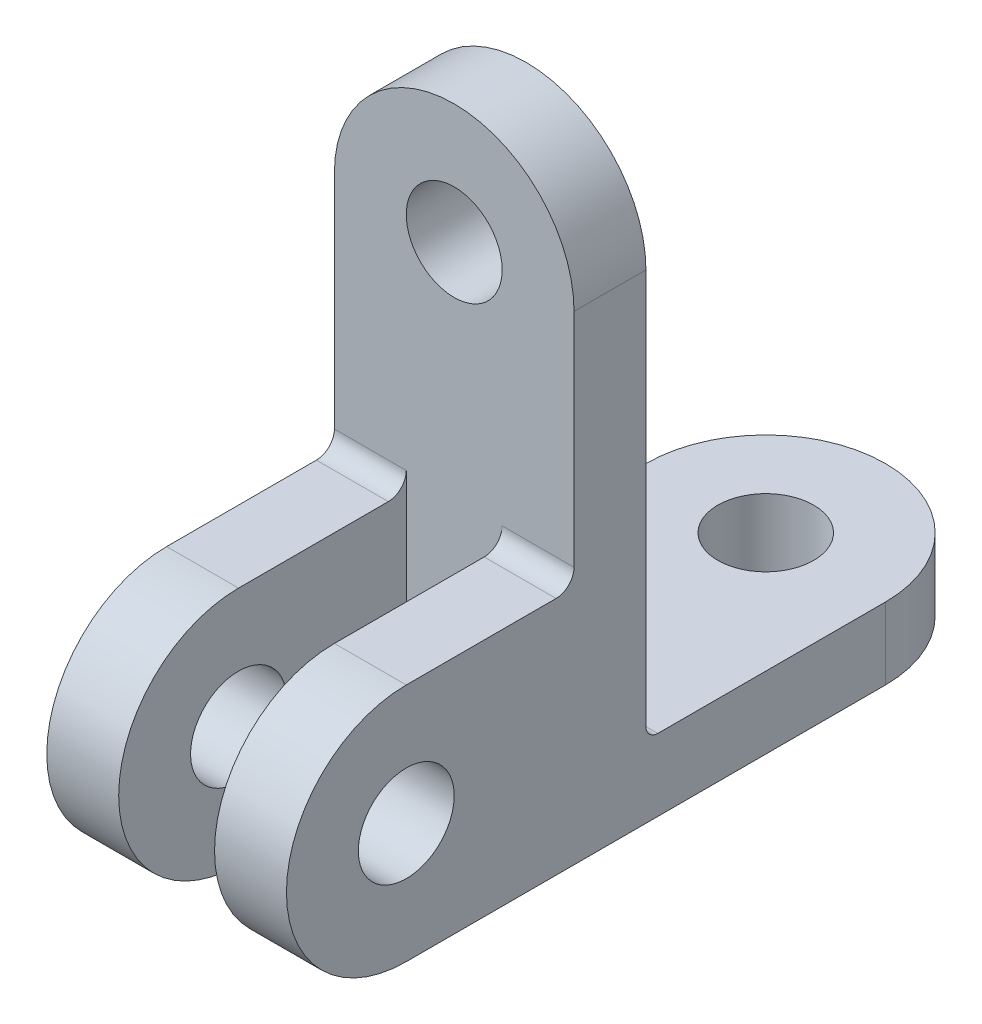
ISO-10303-21;
HEADER;
FILE_DESCRIPTION(('STEP AP214'),'2;1');
FILE_NAME('part.step','',(''),(''),'','','');
FILE_SCHEMA(('AUTOMOTIVE_DESIGN { 1 0 10303 214 1 1 1 1 }'));
ENDSEC;
DATA;
#1=APPLICATION_CONTEXT('core data for automotive mechanical design processes');
#2=APPLICATION_PROTOCOL_DEFINITION('international standard','automotive_design',2000,#1);
#3=PRODUCT_CONTEXT('',#1,'mechanical');
#4=PRODUCT('Part','Part','',(#3));
#5=PRODUCT_RELATED_PRODUCT_CATEGORY('part','',(#4));
#6=PRODUCT_DEFINITION_FORMATION('','',#4);
#7=PRODUCT_DEFINITION_CONTEXT('part definition',#1,'design');
#8=PRODUCT_DEFINITION('design','',#6,#7);
#9=PRODUCT_DEFINITION_SHAPE('','',#8);
#10=(LENGTH_UNIT() NAMED_UNIT(*) SI_UNIT(.MILLI.,.METRE.));
#11=(NAMED_UNIT(*) PLANE_ANGLE_UNIT() SI_UNIT($,.RADIAN.));
#12=(NAMED_UNIT(*) SI_UNIT($,.STERADIAN.) SOLID_ANGLE_UNIT());
#13=UNCERTAINTY_MEASURE_WITH_UNIT(LENGTH_MEASURE(1.E-05),#10,'distance_accuracy_value','');
#14=(GEOMETRIC_REPRESENTATION_CONTEXT(3) GLOBAL_UNCERTAINTY_ASSIGNED_CONTEXT((#13)) GLOBAL_UNIT_ASSIGNED_CONTEXT((#10,
#11,#12)) REPRESENTATION_CONTEXT('',''));
#15=CARTESIAN_POINT('',(0.,0.,0.));
#16=DIRECTION('',(0.,0.,1.));
#17=DIRECTION('',(1.,0.,0.));
#18=AXIS2_PLACEMENT_3D('',#15,#16,#17);
#19=CARTESIAN_POINT('',(20.,0.,40.));
#20=DIRECTION('',(0.,-1.,0.));
#21=DIRECTION('',(0.,0.,-1.));
#22=AXIS2_PLACEMENT_3D('',#19,#20,#21);
#23=PLANE('',#22);
#24=DIRECTION('',(0.,0.,-1.));
#25=VECTOR('',#24,1.);
#26=CARTESIAN_POINT('',(-8.00000000000001,0.,60.));
#27=LINE('',#26,#25);
#28=CARTESIAN_POINT('',(-8.00000000000001,0.,40.));
#29=VERTEX_POINT('',#28);
#30=CARTESIAN_POINT('',(-8.00000000000001,0.,15.));
#31=VERTEX_POINT('',#30);
#32=EDGE_CURVE('E166',#29,#31,#27,.T.);
#33=ORIENTED_EDGE('',*,*,#32,.T.);
#34=DIRECTION('',(1.,0.,0.));
#35=VECTOR('',#34,1.);
#36=CARTESIAN_POINT('',(20.,0.,15.));
#37=LINE('',#36,#35);
#38=CARTESIAN_POINT('',(-20.,0.,15.));
#39=VERTEX_POINT('',#38);
#40=EDGE_CURVE('E200',#31,#39,#37,.F.);
#41=ORIENTED_EDGE('',*,*,#40,.T.);
#42=DIRECTION('',(0.,0.,1.));
#43=VECTOR('',#42,1.);
#44=CARTESIAN_POINT('',(-20.,0.,40.));
#45=LINE('',#44,#43);
#46=CARTESIAN_POINT('',(-20.,0.,40.));
#47=VERTEX_POINT('',#46);
#48=EDGE_CURVE('E254',#39,#47,#45,.T.);
#49=ORIENTED_EDGE('',*,*,#48,.T.);
#50=DIRECTION('',(-1.,0.,0.));
#51=VECTOR('',#50,1.);
#52=CARTESIAN_POINT('',(20.,0.,40.));
#53=LINE('',#52,#51);
#54=EDGE_CURVE('E233',#29,#47,#53,.T.);
#55=ORIENTED_EDGE('',*,*,#54,.F.);
#56=EDGE_LOOP('',(#33,#41,#49,#55));
#57=FACE_BOUND('',#56,.T.);
#58=ADVANCED_FACE('F39',(#57),#23,.F.);
#59=DIRECTION('',(0.,0.,1.));
#60=VECTOR('',#59,1.);
#61=CARTESIAN_POINT('',(20.,0.,40.));
#62=LINE('',#61,#60);
#63=CARTESIAN_POINT('',(20.,0.,15.));
#64=VERTEX_POINT('',#63);
#65=CARTESIAN_POINT('',(20.,0.,40.));
#66=VERTEX_POINT('',#65);
#67=EDGE_CURVE('E250',#64,#66,#62,.T.);
#68=ORIENTED_EDGE('',*,*,#67,.F.);
#69=DIRECTION('',(1.,0.,0.));
#70=VECTOR('',#69,1.);
#71=CARTESIAN_POINT('',(20.,0.,15.));
#72=LINE('',#71,#70);
#73=CARTESIAN_POINT('',(8.00000000000001,0.,15.));
#74=VERTEX_POINT('',#73);
#75=EDGE_CURVE('E202',#64,#74,#72,.F.);
#76=ORIENTED_EDGE('',*,*,#75,.T.);
#77=DIRECTION('',(0.,0.,-1.));
#78=VECTOR('',#77,1.);
#79=CARTESIAN_POINT('',(8.00000000000001,0.,60.));
#80=LINE('',#79,#78);
#81=CARTESIAN_POINT('',(8.00000000000001,0.,40.));
#82=VERTEX_POINT('',#81);
#83=EDGE_CURVE('E281',#82,#74,#80,.T.);
#84=ORIENTED_EDGE('',*,*,#83,.F.);
#85=EDGE_CURVE('E228',#66,#82,#53,.T.);
#86=ORIENTED_EDGE('',*,*,#85,.F.);
#87=EDGE_LOOP('',(#68,#76,#84,#86));
#88=FACE_BOUND('',#87,.T.);
#89=ADVANCED_FACE('F317',(#88),#23,.F.);
#90=CARTESIAN_POINT('',(20.,-20.,40.));
#91=DIRECTION('',(-1.,0.,0.));
#92=DIRECTION('',(0.,0.,1.));
#93=AXIS2_PLACEMENT_3D('',#90,#91,#92);
#94=CYLINDRICAL_SURFACE('',#93,20.);
#95=CARTESIAN_POINT('',(-8.,-20.,40.));
#96=DIRECTION('',(1.,0.,0.));
#97=DIRECTION('',(0.,1.,0.));
#98=AXIS2_PLACEMENT_3D('',#95,#96,#97);
#99=CIRCLE('',#98,20.);
#100=CARTESIAN_POINT('',(-8.,-40.,40.));
#101=VERTEX_POINT('',#100);
#102=EDGE_CURVE('E272',#29,#101,#99,.T.);
#103=ORIENTED_EDGE('',*,*,#102,.F.);
#104=ORIENTED_EDGE('',*,*,#54,.T.);
#105=CARTESIAN_POINT('',(-20.,-20.,40.));
#106=DIRECTION('',(1.,0.,0.));
#107=DIRECTION('',(0.,0.,-1.));
#108=AXIS2_PLACEMENT_3D('',#105,#106,#107);
#109=CIRCLE('',#108,20.);
#110=CARTESIAN_POINT('',(-20.,-40.,40.));
#111=VERTEX_POINT('',#110);
#112=EDGE_CURVE('E251',#47,#111,#109,.T.);
#113=ORIENTED_EDGE('',*,*,#112,.T.);
#114=DIRECTION('',(-1.,0.,0.));
#115=VECTOR('',#114,1.);
#116=CARTESIAN_POINT('',(20.,-40.,40.));
#117=LINE('',#116,#115);
#118=EDGE_CURVE('E247',#101,#111,#117,.T.);
#119=ORIENTED_EDGE('',*,*,#118,.F.);
#120=EDGE_LOOP('',(#103,#104,#113,#119));
#121=FACE_BOUND('',#120,.T.);
#122=ADVANCED_FACE('F312',(#121),#94,.T.);
#123=CARTESIAN_POINT('',(8.,-20.,40.));
#124=DIRECTION('',(-1.,0.,0.));
#125=DIRECTION('',(0.,-1.,0.));
#126=AXIS2_PLACEMENT_3D('',#123,#124,#125);
#127=CIRCLE('',#126,20.);
#128=CARTESIAN_POINT('',(8.,-40.,40.));
#129=VERTEX_POINT('',#128);
#130=EDGE_CURVE('E279',#129,#82,#127,.T.);
#131=ORIENTED_EDGE('',*,*,#130,.F.);
#132=CARTESIAN_POINT('',(20.,-40.,40.));
#133=VERTEX_POINT('',#132);
#134=EDGE_CURVE('E172',#133,#129,#117,.T.);
#135=ORIENTED_EDGE('',*,*,#134,.F.);
#136=CARTESIAN_POINT('',(20.,-20.,40.));
#137=DIRECTION('',(1.,0.,0.));
#138=DIRECTION('',(0.,0.,-1.));
#139=AXIS2_PLACEMENT_3D('',#136,#137,#138);
#140=CIRCLE('',#139,20.);
#141=EDGE_CURVE('E259',#66,#133,#140,.T.);
#142=ORIENTED_EDGE('',*,*,#141,.F.);
#143=ORIENTED_EDGE('',*,*,#85,.T.);
#144=EDGE_LOOP('',(#131,#135,#142,#143));
#145=FACE_BOUND('',#144,.T.);
#146=ADVANCED_FACE('F301',(#145),#94,.T.);
#147=CARTESIAN_POINT('',(20.,-40.,0.));
#148=DIRECTION('',(0.,1.,0.));
#149=DIRECTION('',(0.,0.,1.));
#150=AXIS2_PLACEMENT_3D('',#147,#148,#149);
#151=PLANE('',#150);
#152=CARTESIAN_POINT('',(0.,-40.,-40.));
#153=DIRECTION('',(0.,-1.,0.));
#154=DIRECTION('',(0.,0.,-1.));
#155=AXIS2_PLACEMENT_3D('',#152,#153,#154);
#156=CIRCLE('',#155,8.);
#157=CARTESIAN_POINT('',(0.,-40.,-48.));
#158=VERTEX_POINT('',#157);
#159=EDGE_CURVE('E196',#158,#158,#156,.T.);
#160=ORIENTED_EDGE('',*,*,#159,.F.);
#161=EDGE_LOOP('',(#160));
#162=FACE_BOUND('',#161,.T.);
#163=DIRECTION('',(0.,0.,-1.));
#164=VECTOR('',#163,1.);
#165=CARTESIAN_POINT('',(-8.,-40.,0.));
#166=LINE('',#165,#164);
#167=CARTESIAN_POINT('',(-8.,-40.,12.));
#168=VERTEX_POINT('',#167);
#169=EDGE_CURVE('E173',#101,#168,#166,.T.);
#170=ORIENTED_EDGE('',*,*,#169,.F.);
#171=ORIENTED_EDGE('',*,*,#118,.T.);
#172=DIRECTION('',(0.,0.,-1.));
#173=VECTOR('',#172,1.);
#174=CARTESIAN_POINT('',(-20.,-40.,0.));
#175=LINE('',#174,#173);
#176=CARTESIAN_POINT('',(-20.0000000000001,-40.,-40.));
#177=VERTEX_POINT('',#176);
#178=EDGE_CURVE('E248',#111,#177,#175,.T.);
#179=ORIENTED_EDGE('',*,*,#178,.T.);
#180=CARTESIAN_POINT('',(0.,-40.,-40.));
#181=DIRECTION('',(0.,-1.,0.));
#182=DIRECTION('',(0.,0.,-1.));
#183=AXIS2_PLACEMENT_3D('',#180,#181,#182);
#184=CIRCLE('',#183,20.0000000000001);
#185=CARTESIAN_POINT('',(20.,-40.,-39.9999978741714));
#186=VERTEX_POINT('',#185);
#187=EDGE_CURVE('E268',#177,#186,#184,.T.);
#188=ORIENTED_EDGE('',*,*,#187,.T.);
#189=DIRECTION('',(0.,0.,-1.));
#190=VECTOR('',#189,1.);
#191=CARTESIAN_POINT('',(20.,-40.,0.));
#192=LINE('',#191,#190);
#193=EDGE_CURVE('E257',#133,#186,#192,.T.);
#194=ORIENTED_EDGE('',*,*,#193,.F.);
#195=ORIENTED_EDGE('',*,*,#134,.T.);
#196=DIRECTION('',(0.,0.,1.));
#197=VECTOR('',#196,1.);
#198=CARTESIAN_POINT('',(8.,-40.,0.));
#199=LINE('',#198,#197);
#200=CARTESIAN_POINT('',(8.,-40.,12.));
#201=VERTEX_POINT('',#200);
#202=EDGE_CURVE('E160',#201,#129,#199,.T.);
#203=ORIENTED_EDGE('',*,*,#202,.F.);
#204=DIRECTION('',(1.,0.,0.));
#205=VECTOR('',#204,1.);
#206=CARTESIAN_POINT('',(-8.,-40.,12.));
#207=LINE('',#206,#205);
#208=EDGE_CURVE('E144',#168,#201,#207,.T.);
#209=ORIENTED_EDGE('',*,*,#208,.F.);
#210=EDGE_LOOP('',(#170,#171,#179,#188,#194,#195,#203,#209));
#211=FACE_BOUND('',#210,.T.);
#212=ADVANCED_FACE('F169',(#162,#211),#151,.F.);
#213=CARTESIAN_POINT('',(-20.,40.,12.));
#214=DIRECTION('',(1.,0.,0.));
#215=DIRECTION('',(0.,1.,0.));
#216=AXIS2_PLACEMENT_3D('',#213,#214,#215);
#217=PLANE('',#216);
#218=CARTESIAN_POINT('',(-20.0000000000001,-20.,40.));
#219=DIRECTION('',(1.,0.,0.));
#220=DIRECTION('',(0.,1.,0.));
#221=AXIS2_PLACEMENT_3D('',#218,#219,#220);
#222=CIRCLE('',#221,8.);
#223=CARTESIAN_POINT('',(-20.0000000000001,-12.,40.));
#224=VERTEX_POINT('',#223);
#225=EDGE_CURVE('E187',#224,#224,#222,.T.);
#226=ORIENTED_EDGE('',*,*,#225,.T.);
#227=EDGE_LOOP('',(#226));
#228=FACE_BOUND('',#227,.T.);
#229=DIRECTION('',(0.,-1.,0.));
#230=VECTOR('',#229,1.);
#231=CARTESIAN_POINT('',(-20.,40.,0.));
#232=LINE('',#231,#230);
#233=CARTESIAN_POINT('',(-20.,40.,0.));
#234=VERTEX_POINT('',#233);
#235=CARTESIAN_POINT('',(-20.,-26.,0.));
#236=VERTEX_POINT('',#235);
#237=EDGE_CURVE('E220',#234,#236,#232,.T.);
#238=ORIENTED_EDGE('',*,*,#237,.T.);
#239=CARTESIAN_POINT('',(-20.,-26.,-2.));
#240=DIRECTION('',(1.,0.,0.));
#241=DIRECTION('',(0.,1.,0.));
#242=AXIS2_PLACEMENT_3D('',#239,#240,#241);
#243=CIRCLE('',#242,2.);
#244=CARTESIAN_POINT('',(-20.,-28.,-2.00000000000002));
#245=VERTEX_POINT('',#244);
#246=EDGE_CURVE('E47',#236,#245,#243,.T.);
#247=ORIENTED_EDGE('',*,*,#246,.T.);
#248=DIRECTION('',(0.,0.,-1.));
#249=VECTOR('',#248,1.);
#250=CARTESIAN_POINT('',(-20.,-28.,-40.));
#251=LINE('',#250,#249);
#252=CARTESIAN_POINT('',(-20.0000000000001,-28.,-40.));
#253=VERTEX_POINT('',#252);
#254=EDGE_CURVE('E271',#245,#253,#251,.T.);
#255=ORIENTED_EDGE('',*,*,#254,.T.);
#256=DIRECTION('',(0.,-1.,0.));
#257=VECTOR('',#256,1.);
#258=CARTESIAN_POINT('',(-20.0000000000001,-28.,-40.));
#259=LINE('',#258,#257);
#260=EDGE_CURVE('E262',#253,#177,#259,.T.);
#261=ORIENTED_EDGE('',*,*,#260,.T.);
#262=ORIENTED_EDGE('',*,*,#178,.F.);
#263=ORIENTED_EDGE('',*,*,#112,.F.);
#264=ORIENTED_EDGE('',*,*,#48,.F.);
#265=CARTESIAN_POINT('',(-20.,3.,15.));
#266=DIRECTION('',(1.,0.,0.));
#267=DIRECTION('',(0.,1.,0.));
#268=AXIS2_PLACEMENT_3D('',#265,#266,#267);
#269=CIRCLE('',#268,3.);
#270=CARTESIAN_POINT('',(-20.,3.,12.));
#271=VERTEX_POINT('',#270);
#272=EDGE_CURVE('E206',#39,#271,#269,.T.);
#273=ORIENTED_EDGE('',*,*,#272,.T.);
#274=DIRECTION('',(0.,-1.,0.));
#275=VECTOR('',#274,1.);
#276=CARTESIAN_POINT('',(-20.,40.,12.));
#277=LINE('',#276,#275);
#278=CARTESIAN_POINT('',(-20.,40.,12.));
#279=VERTEX_POINT('',#278);
#280=EDGE_CURVE('E239',#279,#271,#277,.T.);
#281=ORIENTED_EDGE('',*,*,#280,.F.);
#282=DIRECTION('',(0.,0.,-1.));
#283=VECTOR('',#282,1.);
#284=CARTESIAN_POINT('',(-20.,40.,12.));
#285=LINE('',#284,#283);
#286=EDGE_CURVE('E179',#279,#234,#285,.T.);
#287=ORIENTED_EDGE('',*,*,#286,.T.);
#288=EDGE_LOOP('',(#238,#247,#255,#261,#262,#263,#264,#273,#281,#287));
#289=FACE_BOUND('',#288,.T.);
#290=ADVANCED_FACE('F225',(#228,#289),#217,.F.);
#291=CARTESIAN_POINT('',(20.,40.,12.));
#292=DIRECTION('',(-1.,0.,0.));
#293=DIRECTION('',(0.,-1.,0.));
#294=AXIS2_PLACEMENT_3D('',#291,#292,#293);
#295=PLANE('',#294);
#296=CARTESIAN_POINT('',(20.,-20.,40.));
#297=DIRECTION('',(1.,0.,0.));
#298=DIRECTION('',(0.,1.,0.));
#299=AXIS2_PLACEMENT_3D('',#296,#297,#298);
#300=CIRCLE('',#299,8.);
#301=CARTESIAN_POINT('',(20.,-12.,40.));
#302=VERTEX_POINT('',#301);
#303=EDGE_CURVE('E191',#302,#302,#300,.T.);
#304=ORIENTED_EDGE('',*,*,#303,.F.);
#305=EDGE_LOOP('',(#304));
#306=FACE_BOUND('',#305,.T.);
#307=ORIENTED_EDGE('',*,*,#193,.T.);
#308=DIRECTION('',(0.,-1.,0.));
#309=VECTOR('',#308,1.);
#310=CARTESIAN_POINT('',(20.,-28.,-39.9999978741714));
#311=LINE('',#310,#309);
#312=CARTESIAN_POINT('',(20.,-28.,-39.9999978741714));
#313=VERTEX_POINT('',#312);
#314=EDGE_CURVE('E256',#313,#186,#311,.T.);
#315=ORIENTED_EDGE('',*,*,#314,.F.);
#316=DIRECTION('',(0.,0.,1.));
#317=VECTOR('',#316,1.);
#318=CARTESIAN_POINT('',(20.,-28.,0.));
#319=LINE('',#318,#317);
#320=CARTESIAN_POINT('',(20.,-28.,-2.));
#321=VERTEX_POINT('',#320);
#322=EDGE_CURVE('E265',#313,#321,#319,.T.);
#323=ORIENTED_EDGE('',*,*,#322,.T.);
#324=CARTESIAN_POINT('',(20.,-26.,-2.));
#325=DIRECTION('',(-1.,0.,0.));
#326=DIRECTION('',(0.,-1.,0.));
#327=AXIS2_PLACEMENT_3D('',#324,#325,#326);
#328=CIRCLE('',#327,2.);
#329=CARTESIAN_POINT('',(20.,-26.,0.));
#330=VERTEX_POINT('',#329);
#331=EDGE_CURVE('E11',#321,#330,#328,.T.);
#332=ORIENTED_EDGE('',*,*,#331,.T.);
#333=DIRECTION('',(0.,1.,0.));
#334=VECTOR('',#333,1.);
#335=CARTESIAN_POINT('',(20.,40.,0.));
#336=LINE('',#335,#334);
#337=CARTESIAN_POINT('',(20.,40.,0.));
#338=VERTEX_POINT('',#337);
#339=EDGE_CURVE('E221',#330,#338,#336,.T.);
#340=ORIENTED_EDGE('',*,*,#339,.T.);
#341=DIRECTION('',(0.,0.,-1.));
#342=VECTOR('',#341,1.);
#343=CARTESIAN_POINT('',(20.,40.,12.));
#344=LINE('',#343,#342);
#345=CARTESIAN_POINT('',(20.,40.,12.));
#346=VERTEX_POINT('',#345);
#347=EDGE_CURVE('E174',#346,#338,#344,.T.);
#348=ORIENTED_EDGE('',*,*,#347,.F.);
#349=DIRECTION('',(0.,1.,0.));
#350=VECTOR('',#349,1.);
#351=CARTESIAN_POINT('',(20.,40.,12.));
#352=LINE('',#351,#350);
#353=CARTESIAN_POINT('',(20.,3.,12.));
#354=VERTEX_POINT('',#353);
#355=EDGE_CURVE('E240',#354,#346,#352,.T.);
#356=ORIENTED_EDGE('',*,*,#355,.F.);
#357=CARTESIAN_POINT('',(20.,3.,15.));
#358=DIRECTION('',(-1.,0.,0.));
#359=DIRECTION('',(0.,-1.,0.));
#360=AXIS2_PLACEMENT_3D('',#357,#358,#359);
#361=CIRCLE('',#360,3.);
#362=EDGE_CURVE('E208',#354,#64,#361,.T.);
#363=ORIENTED_EDGE('',*,*,#362,.T.);
#364=ORIENTED_EDGE('',*,*,#67,.T.);
#365=ORIENTED_EDGE('',*,*,#141,.T.);
#366=EDGE_LOOP('',(#307,#315,#323,#332,#340,#348,#356,#363,#364,#365));
#367=FACE_BOUND('',#366,.T.);
#368=ADVANCED_FACE('F308',(#306,#367),#295,.F.);
#369=CARTESIAN_POINT('',(0.,40.,12.));
#370=DIRECTION('',(0.,0.,-1.));
#371=DIRECTION('',(-1.,0.,0.));
#372=AXIS2_PLACEMENT_3D('',#369,#370,#371);
#373=CYLINDRICAL_SURFACE('',#372,20.);
#374=CARTESIAN_POINT('',(0.,40.,0.));
#375=DIRECTION('',(0.,0.,1.));
#376=DIRECTION('',(1.,0.,0.));
#377=AXIS2_PLACEMENT_3D('',#374,#375,#376);
#378=CIRCLE('',#377,20.);
#379=EDGE_CURVE('E230',#338,#234,#378,.T.);
#380=ORIENTED_EDGE('',*,*,#379,.T.);
#381=ORIENTED_EDGE('',*,*,#286,.F.);
#382=CARTESIAN_POINT('',(0.,40.,12.));
#383=DIRECTION('',(0.,0.,1.));
#384=DIRECTION('',(1.,0.,0.));
#385=AXIS2_PLACEMENT_3D('',#382,#383,#384);
#386=CIRCLE('',#385,20.);
#387=EDGE_CURVE('E236',#346,#279,#386,.T.);
#388=ORIENTED_EDGE('',*,*,#387,.F.);
#389=ORIENTED_EDGE('',*,*,#347,.T.);
#390=EDGE_LOOP('',(#380,#381,#388,#389));
#391=FACE_BOUND('',#390,.T.);
#392=ADVANCED_FACE('F327',(#391),#373,.T.);
#393=CARTESIAN_POINT('',(0.,40.,12.));
#394=DIRECTION('',(0.,0.,1.));
#395=DIRECTION('',(1.,0.,0.));
#396=AXIS2_PLACEMENT_3D('',#393,#394,#395);
#397=PLANE('',#396);
#398=CARTESIAN_POINT('',(0.,40.,12.));
#399=DIRECTION('',(0.,0.,1.));
#400=DIRECTION('',(1.,0.,0.));
#401=AXIS2_PLACEMENT_3D('',#398,#399,#400);
#402=CIRCLE('',#401,8.);
#403=CARTESIAN_POINT('',(8.,40.,12.));
#404=VERTEX_POINT('',#403);
#405=EDGE_CURVE('E192',#404,#404,#402,.T.);
#406=ORIENTED_EDGE('',*,*,#405,.F.);
#407=EDGE_LOOP('',(#406));
#408=FACE_BOUND('',#407,.T.);
#409=ORIENTED_EDGE('',*,*,#280,.T.);
#410=DIRECTION('',(1.,0.,0.));
#411=VECTOR('',#410,1.);
#412=CARTESIAN_POINT('',(0.,3.,12.));
#413=LINE('',#412,#411);
#414=CARTESIAN_POINT('',(-8.00000000000001,3.,12.));
#415=VERTEX_POINT('',#414);
#416=EDGE_CURVE('E198',#271,#415,#413,.T.);
#417=ORIENTED_EDGE('',*,*,#416,.T.);
#418=DIRECTION('',(0.,-1.,0.));
#419=VECTOR('',#418,1.);
#420=CARTESIAN_POINT('',(-8.00000000000001,0.,12.));
#421=LINE('',#420,#419);
#422=EDGE_CURVE('E152',#415,#168,#421,.T.);
#423=ORIENTED_EDGE('',*,*,#422,.T.);
#424=ORIENTED_EDGE('',*,*,#208,.T.);
#425=DIRECTION('',(0.,1.,0.));
#426=VECTOR('',#425,1.);
#427=CARTESIAN_POINT('',(8.00000000000001,0.,12.));
#428=LINE('',#427,#426);
#429=CARTESIAN_POINT('',(8.00000000000001,3.,12.));
#430=VERTEX_POINT('',#429);
#431=EDGE_CURVE('E149',#201,#430,#428,.T.);
#432=ORIENTED_EDGE('',*,*,#431,.T.);
#433=DIRECTION('',(1.,0.,0.));
#434=VECTOR('',#433,1.);
#435=CARTESIAN_POINT('',(0.,3.,12.));
#436=LINE('',#435,#434);
#437=EDGE_CURVE('E176',#430,#354,#436,.T.);
#438=ORIENTED_EDGE('',*,*,#437,.T.);
#439=ORIENTED_EDGE('',*,*,#355,.T.);
#440=ORIENTED_EDGE('',*,*,#387,.T.);
#441=EDGE_LOOP('',(#409,#417,#423,#424,#432,#438,#439,#440));
#442=FACE_BOUND('',#441,.T.);
#443=ADVANCED_FACE('F147',(#408,#442),#397,.T.);
#444=CARTESIAN_POINT('',(0.,40.,0.));
#445=DIRECTION('',(0.,0.,1.));
#446=DIRECTION('',(1.,0.,0.));
#447=AXIS2_PLACEMENT_3D('',#444,#445,#446);
#448=PLANE('',#447);
#449=CARTESIAN_POINT('',(0.,40.,0.));
#450=DIRECTION('',(0.,0.,1.));
#451=DIRECTION('',(1.,0.,0.));
#452=AXIS2_PLACEMENT_3D('',#449,#450,#451);
#453=CIRCLE('',#452,8.);
#454=CARTESIAN_POINT('',(8.,40.,0.));
#455=VERTEX_POINT('',#454);
#456=EDGE_CURVE('E188',#455,#455,#453,.T.);
#457=ORIENTED_EDGE('',*,*,#456,.T.);
#458=EDGE_LOOP('',(#457));
#459=FACE_BOUND('',#458,.T.);
#460=ORIENTED_EDGE('',*,*,#339,.F.);
#461=DIRECTION('',(-1.,0.,0.));
#462=VECTOR('',#461,1.);
#463=CARTESIAN_POINT('',(-20.,-26.,0.));
#464=LINE('',#463,#462);
#465=EDGE_CURVE('E211',#330,#236,#464,.T.);
#466=ORIENTED_EDGE('',*,*,#465,.T.);
#467=ORIENTED_EDGE('',*,*,#237,.F.);
#468=ORIENTED_EDGE('',*,*,#379,.F.);
#469=EDGE_LOOP('',(#460,#466,#467,#468));
#470=FACE_BOUND('',#469,.T.);
#471=ADVANCED_FACE('F218',(#459,#470),#448,.F.);
#472=CARTESIAN_POINT('',(0.,-28.,-40.));
#473=DIRECTION('',(0.,-1.,0.));
#474=DIRECTION('',(0.,0.,-1.));
#475=AXIS2_PLACEMENT_3D('',#472,#473,#474);
#476=CYLINDRICAL_SURFACE('',#475,20.0000000000001);
#477=ORIENTED_EDGE('',*,*,#187,.F.);
#478=ORIENTED_EDGE('',*,*,#260,.F.);
#479=CARTESIAN_POINT('',(0.,-28.,-40.));
#480=DIRECTION('',(0.,-1.,0.));
#481=DIRECTION('',(0.,0.,-1.));
#482=AXIS2_PLACEMENT_3D('',#479,#480,#481);
#483=CIRCLE('',#482,20.0000000000001);
#484=EDGE_CURVE('E274',#253,#313,#483,.T.);
#485=ORIENTED_EDGE('',*,*,#484,.T.);
#486=ORIENTED_EDGE('',*,*,#314,.T.);
#487=EDGE_LOOP('',(#477,#478,#485,#486));
#488=FACE_BOUND('',#487,.T.);
#489=ADVANCED_FACE('F331',(#488),#476,.T.);
#490=CARTESIAN_POINT('',(0.,-28.,-40.));
#491=DIRECTION('',(0.,-1.,0.));
#492=DIRECTION('',(0.,0.,-1.));
#493=AXIS2_PLACEMENT_3D('',#490,#491,#492);
#494=PLANE('',#493);
#495=CARTESIAN_POINT('',(0.,-28.,-40.));
#496=DIRECTION('',(0.,-1.,0.));
#497=DIRECTION('',(0.,0.,-1.));
#498=AXIS2_PLACEMENT_3D('',#495,#496,#497);
#499=CIRCLE('',#498,8.);
#500=CARTESIAN_POINT('',(0.,-28.,-48.));
#501=VERTEX_POINT('',#500);
#502=EDGE_CURVE('E193',#501,#501,#499,.T.);
#503=ORIENTED_EDGE('',*,*,#502,.T.);
#504=EDGE_LOOP('',(#503));
#505=FACE_BOUND('',#504,.T.);
#506=ORIENTED_EDGE('',*,*,#254,.F.);
#507=DIRECTION('',(-1.,0.,0.));
#508=VECTOR('',#507,1.);
#509=CARTESIAN_POINT('',(20.,-28.,-2.));
#510=LINE('',#509,#508);
#511=EDGE_CURVE('E54',#245,#321,#510,.F.);
#512=ORIENTED_EDGE('',*,*,#511,.T.);
#513=ORIENTED_EDGE('',*,*,#322,.F.);
#514=ORIENTED_EDGE('',*,*,#484,.F.);
#515=EDGE_LOOP('',(#506,#512,#513,#514));
#516=FACE_BOUND('',#515,.T.);
#517=ADVANCED_FACE('F369',(#505,#516),#494,.F.);
#518=CARTESIAN_POINT('',(-8.00000000000001,0.,60.));
#519=DIRECTION('',(1.,0.,0.));
#520=DIRECTION('',(0.,1.,0.));
#521=AXIS2_PLACEMENT_3D('',#518,#519,#520);
#522=PLANE('',#521);
#523=CARTESIAN_POINT('',(-8.,-20.,40.));
#524=DIRECTION('',(1.,0.,0.));
#525=DIRECTION('',(0.,1.,0.));
#526=AXIS2_PLACEMENT_3D('',#523,#524,#525);
#527=CIRCLE('',#526,8.);
#528=CARTESIAN_POINT('',(-8.,-12.,40.));
#529=VERTEX_POINT('',#528);
#530=EDGE_CURVE('E186',#529,#529,#527,.T.);
#531=ORIENTED_EDGE('',*,*,#530,.F.);
#532=EDGE_LOOP('',(#531));
#533=FACE_BOUND('',#532,.T.);
#534=ORIENTED_EDGE('',*,*,#102,.T.);
#535=ORIENTED_EDGE('',*,*,#169,.T.);
#536=ORIENTED_EDGE('',*,*,#422,.F.);
#537=CARTESIAN_POINT('',(-8.00000000000001,3.,15.));
#538=DIRECTION('',(1.,0.,0.));
#539=DIRECTION('',(0.,1.,0.));
#540=AXIS2_PLACEMENT_3D('',#537,#538,#539);
#541=CIRCLE('',#540,3.);
#542=EDGE_CURVE('E204',#415,#31,#541,.F.);
#543=ORIENTED_EDGE('',*,*,#542,.T.);
#544=ORIENTED_EDGE('',*,*,#32,.F.);
#545=EDGE_LOOP('',(#534,#535,#536,#543,#544));
#546=FACE_BOUND('',#545,.T.);
#547=ADVANCED_FACE('F357',(#533,#546),#522,.T.);
#548=CARTESIAN_POINT('',(8.00000000000001,0.,60.));
#549=DIRECTION('',(-1.,0.,0.));
#550=DIRECTION('',(0.,-1.,0.));
#551=AXIS2_PLACEMENT_3D('',#548,#549,#550);
#552=PLANE('',#551);
#553=CARTESIAN_POINT('',(8.,-20.,40.));
#554=DIRECTION('',(-1.,0.,0.));
#555=DIRECTION('',(0.,-1.,0.));
#556=AXIS2_PLACEMENT_3D('',#553,#554,#555);
#557=CIRCLE('',#556,8.);
#558=CARTESIAN_POINT('',(8.,-28.,40.));
#559=VERTEX_POINT('',#558);
#560=EDGE_CURVE('E183',#559,#559,#557,.T.);
#561=ORIENTED_EDGE('',*,*,#560,.F.);
#562=EDGE_LOOP('',(#561));
#563=FACE_BOUND('',#562,.T.);
#564=ORIENTED_EDGE('',*,*,#130,.T.);
#565=ORIENTED_EDGE('',*,*,#83,.T.);
#566=CARTESIAN_POINT('',(8.00000000000001,3.,15.));
#567=DIRECTION('',(-1.,0.,0.));
#568=DIRECTION('',(0.,-1.,0.));
#569=AXIS2_PLACEMENT_3D('',#566,#567,#568);
#570=CIRCLE('',#569,3.);
#571=EDGE_CURVE('E164',#74,#430,#570,.F.);
#572=ORIENTED_EDGE('',*,*,#571,.T.);
#573=ORIENTED_EDGE('',*,*,#431,.F.);
#574=ORIENTED_EDGE('',*,*,#202,.T.);
#575=EDGE_LOOP('',(#564,#565,#572,#573,#574));
#576=FACE_BOUND('',#575,.T.);
#577=ADVANCED_FACE('F159',(#563,#576),#552,.T.);
#578=CARTESIAN_POINT('',(-20.0000000000001,-20.,40.));
#579=DIRECTION('',(1.,0.,0.));
#580=DIRECTION('',(0.,1.,0.));
#581=AXIS2_PLACEMENT_3D('',#578,#579,#580);
#582=CYLINDRICAL_SURFACE('',#581,8.);
#583=ORIENTED_EDGE('',*,*,#560,.T.);
#584=EDGE_LOOP('',(#583));
#585=FACE_BOUND('',#584,.T.);
#586=ORIENTED_EDGE('',*,*,#303,.T.);
#587=EDGE_LOOP('',(#586));
#588=FACE_BOUND('',#587,.T.);
#589=ADVANCED_FACE('F382',(#585,#588),#582,.F.);
#590=ORIENTED_EDGE('',*,*,#530,.T.);
#591=EDGE_LOOP('',(#590));
#592=FACE_BOUND('',#591,.T.);
#593=ORIENTED_EDGE('',*,*,#225,.F.);
#594=EDGE_LOOP('',(#593));
#595=FACE_BOUND('',#594,.T.);
#596=ADVANCED_FACE('F386',(#592,#595),#582,.F.);
#597=CARTESIAN_POINT('',(0.,40.,-60.0000000000001));
#598=DIRECTION('',(0.,0.,1.));
#599=DIRECTION('',(1.,0.,0.));
#600=AXIS2_PLACEMENT_3D('',#597,#598,#599);
#601=CYLINDRICAL_SURFACE('',#600,8.);
#602=ORIENTED_EDGE('',*,*,#405,.T.);
#603=EDGE_LOOP('',(#602));
#604=FACE_BOUND('',#603,.T.);
#605=ORIENTED_EDGE('',*,*,#456,.F.);
#606=EDGE_LOOP('',(#605));
#607=FACE_BOUND('',#606,.T.);
#608=ADVANCED_FACE('F388',(#604,#607),#601,.F.);
#609=CARTESIAN_POINT('',(0.,60.,-40.));
#610=DIRECTION('',(0.,-1.,0.));
#611=DIRECTION('',(0.,0.,-1.));
#612=AXIS2_PLACEMENT_3D('',#609,#610,#611);
#613=CYLINDRICAL_SURFACE('',#612,8.);
#614=ORIENTED_EDGE('',*,*,#159,.T.);
#615=EDGE_LOOP('',(#614));
#616=FACE_BOUND('',#615,.T.);
#617=ORIENTED_EDGE('',*,*,#502,.F.);
#618=EDGE_LOOP('',(#617));
#619=FACE_BOUND('',#618,.T.);
#620=ADVANCED_FACE('F297',(#616,#619),#613,.F.);
#621=CARTESIAN_POINT('',(0.,3.,15.));
#622=DIRECTION('',(1.,0.,0.));
#623=DIRECTION('',(0.,0.,-1.));
#624=AXIS2_PLACEMENT_3D('',#621,#622,#623);
#625=CYLINDRICAL_SURFACE('',#624,3.);
#626=ORIENTED_EDGE('',*,*,#272,.F.);
#627=ORIENTED_EDGE('',*,*,#40,.F.);
#628=ORIENTED_EDGE('',*,*,#542,.F.);
#629=ORIENTED_EDGE('',*,*,#416,.F.);
#630=EDGE_LOOP('',(#626,#627,#628,#629));
#631=FACE_BOUND('',#630,.T.);
#632=ADVANCED_FACE('F339',(#631),#625,.F.);
#633=CARTESIAN_POINT('',(0.,3.,15.));
#634=DIRECTION('',(1.,0.,0.));
#635=DIRECTION('',(0.,0.,-1.));
#636=AXIS2_PLACEMENT_3D('',#633,#634,#635);
#637=CYLINDRICAL_SURFACE('',#636,3.);
#638=ORIENTED_EDGE('',*,*,#571,.F.);
#639=ORIENTED_EDGE('',*,*,#75,.F.);
#640=ORIENTED_EDGE('',*,*,#362,.F.);
#641=ORIENTED_EDGE('',*,*,#437,.F.);
#642=EDGE_LOOP('',(#638,#639,#640,#641));
#643=FACE_BOUND('',#642,.T.);
#644=ADVANCED_FACE('F341',(#643),#637,.F.);
#645=CARTESIAN_POINT('',(0.,-26.,-2.));
#646=DIRECTION('',(1.,0.,0.));
#647=DIRECTION('',(0.,0.,-1.));
#648=AXIS2_PLACEMENT_3D('',#645,#646,#647);
#649=CYLINDRICAL_SURFACE('',#648,2.);
#650=ORIENTED_EDGE('',*,*,#331,.F.);
#651=ORIENTED_EDGE('',*,*,#511,.F.);
#652=ORIENTED_EDGE('',*,*,#246,.F.);
#653=ORIENTED_EDGE('',*,*,#465,.F.);
#654=EDGE_LOOP('',(#650,#651,#652,#653));
#655=FACE_BOUND('',#654,.T.);
#656=ADVANCED_FACE('F41',(#655),#649,.F.);
#657=CLOSED_SHELL('',(#58,#89,#122,#146,#212,#290,#368,#392,#443,#471,#489,#517,#547,#577,#589,
#596,#608,#620,#632,#644,#656));
#658=MANIFOLD_SOLID_BREP('B2',#657);
#659=ADVANCED_BREP_SHAPE_REPRESENTATION('',(#18,#658),#14);
#660=SHAPE_DEFINITION_REPRESENTATION(#9,#659);
ENDSEC;
END-ISO-10303-21;
